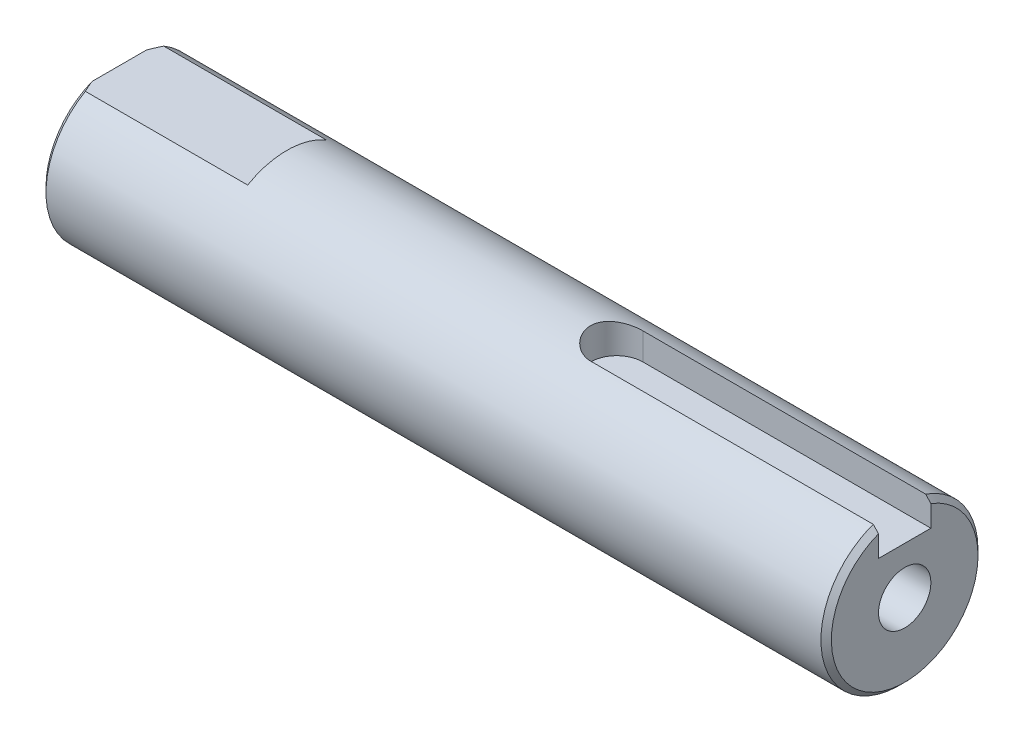
ISO-10303-21;
HEADER;
FILE_DESCRIPTION(('STEP AP214'),'2;1');
FILE_NAME('part.step','',(''),(''),'','','');
FILE_SCHEMA(('AUTOMOTIVE_DESIGN { 1 0 10303 214 1 1 1 1 }'));
ENDSEC;
DATA;
#1=APPLICATION_CONTEXT('core data for automotive mechanical design processes');
#2=APPLICATION_PROTOCOL_DEFINITION('international standard','automotive_design',2000,#1);
#3=PRODUCT_CONTEXT('',#1,'mechanical');
#4=PRODUCT('Part','Part','',(#3));
#5=PRODUCT_RELATED_PRODUCT_CATEGORY('part','',(#4));
#6=PRODUCT_DEFINITION_FORMATION('','',#4);
#7=PRODUCT_DEFINITION_CONTEXT('part definition',#1,'design');
#8=PRODUCT_DEFINITION('design','',#6,#7);
#9=PRODUCT_DEFINITION_SHAPE('','',#8);
#10=(LENGTH_UNIT() NAMED_UNIT(*) SI_UNIT(.MILLI.,.METRE.));
#11=(NAMED_UNIT(*) PLANE_ANGLE_UNIT() SI_UNIT($,.RADIAN.));
#12=(NAMED_UNIT(*) SI_UNIT($,.STERADIAN.) SOLID_ANGLE_UNIT());
#13=UNCERTAINTY_MEASURE_WITH_UNIT(LENGTH_MEASURE(1.E-05),#10,'distance_accuracy_value','');
#14=(GEOMETRIC_REPRESENTATION_CONTEXT(3) GLOBAL_UNCERTAINTY_ASSIGNED_CONTEXT((#13)) GLOBAL_UNIT_ASSIGNED_CONTEXT((#10,
#11,#12)) REPRESENTATION_CONTEXT('',''));
#15=CARTESIAN_POINT('',(0.,0.,0.));
#16=DIRECTION('',(0.,0.,1.));
#17=DIRECTION('',(1.,0.,0.));
#18=AXIS2_PLACEMENT_3D('',#15,#16,#17);
#19=CARTESIAN_POINT('',(0.,0.,0.));
#20=DIRECTION('',(1.,0.,0.));
#21=DIRECTION('',(0.,0.,-1.));
#22=AXIS2_PLACEMENT_3D('',#19,#20,#21);
#23=PLANE('',#22);
#24=DIRECTION('',(0.,0.,-1.));
#25=VECTOR('',#24,1.);
#26=CARTESIAN_POINT('',(0.,6.5,0.));
#27=LINE('',#26,#25);
#28=CARTESIAN_POINT('',(0.,6.5,2.59807621135328));
#29=VERTEX_POINT('',#28);
#30=CARTESIAN_POINT('',(0.,6.5,-2.59807621135328));
#31=VERTEX_POINT('',#30);
#32=EDGE_CURVE('E207',#29,#31,#27,.T.);
#33=ORIENTED_EDGE('',*,*,#32,.T.);
#34=CARTESIAN_POINT('',(0.,0.,0.));
#35=DIRECTION('',(1.,0.,0.));
#36=DIRECTION('',(0.,0.,-1.));
#37=AXIS2_PLACEMENT_3D('',#34,#35,#36);
#38=CIRCLE('',#37,6.99999999999998);
#39=CARTESIAN_POINT('',(0.,-6.5,-2.59807621135328));
#40=VERTEX_POINT('',#39);
#41=EDGE_CURVE('E401',#31,#40,#38,.F.);
#42=ORIENTED_EDGE('',*,*,#41,.T.);
#43=DIRECTION('',(0.,0.,1.));
#44=VECTOR('',#43,1.);
#45=CARTESIAN_POINT('',(0.,-6.5,0.));
#46=LINE('',#45,#44);
#47=CARTESIAN_POINT('',(0.,-6.5,2.59807621135328));
#48=VERTEX_POINT('',#47);
#49=EDGE_CURVE('E315',#40,#48,#46,.T.);
#50=ORIENTED_EDGE('',*,*,#49,.T.);
#51=CARTESIAN_POINT('',(0.,0.,0.));
#52=DIRECTION('',(1.,0.,0.));
#53=DIRECTION('',(0.,0.,-1.));
#54=AXIS2_PLACEMENT_3D('',#51,#52,#53);
#55=CIRCLE('',#54,6.99999999999998);
#56=EDGE_CURVE('E259',#48,#29,#55,.F.);
#57=ORIENTED_EDGE('',*,*,#56,.T.);
#58=EDGE_LOOP('',(#33,#42,#50,#57));
#59=FACE_BOUND('',#58,.T.);
#60=CARTESIAN_POINT('',(0.,0.,0.));
#61=DIRECTION('',(-1.,0.,0.));
#62=DIRECTION('',(0.,0.,1.));
#63=AXIS2_PLACEMENT_3D('',#60,#61,#62);
#64=CIRCLE('',#63,2.5);
#65=CARTESIAN_POINT('',(0.,0.,2.5));
#66=VERTEX_POINT('',#65);
#67=EDGE_CURVE('E517',#66,#66,#64,.T.);
#68=ORIENTED_EDGE('',*,*,#67,.F.);
#69=EDGE_LOOP('',(#68));
#70=FACE_BOUND('',#69,.T.);
#71=ADVANCED_FACE('F36',(#59,#70),#23,.F.);
#72=CARTESIAN_POINT('',(0.,0.,0.));
#73=DIRECTION('',(-1.,0.,0.));
#74=DIRECTION('',(0.,0.,1.));
#75=AXIS2_PLACEMENT_3D('',#72,#73,#74);
#76=CYLINDRICAL_SURFACE('',#75,7.5);
#77=DIRECTION('',(-1.,0.,0.));
#78=VECTOR('',#77,1.);
#79=CARTESIAN_POINT('',(0.,-6.5,-3.74165738677394));
#80=LINE('',#79,#78);
#81=CARTESIAN_POINT('',(16.,-6.5,-3.74165738677395));
#82=VERTEX_POINT('',#81);
#83=CARTESIAN_POINT('',(0.500000000000026,-6.5,-3.74165738677394));
#84=VERTEX_POINT('',#83);
#85=EDGE_CURVE('E163',#82,#84,#80,.T.);
#86=ORIENTED_EDGE('',*,*,#85,.T.);
#87=CARTESIAN_POINT('',(0.500000000000026,0.,0.));
#88=DIRECTION('',(1.,0.,0.));
#89=DIRECTION('',(0.,0.,-1.));
#90=AXIS2_PLACEMENT_3D('',#87,#88,#89);
#91=CIRCLE('',#90,7.5);
#92=CARTESIAN_POINT('',(0.500000000000027,6.5,-3.74165738677394));
#93=VERTEX_POINT('',#92);
#94=EDGE_CURVE('E317',#84,#93,#91,.T.);
#95=ORIENTED_EDGE('',*,*,#94,.T.);
#96=DIRECTION('',(-1.,0.,0.));
#97=VECTOR('',#96,1.);
#98=CARTESIAN_POINT('',(0.,6.5,-3.74165738677394));
#99=LINE('',#98,#97);
#100=CARTESIAN_POINT('',(16.,6.5,-3.74165738677394));
#101=VERTEX_POINT('',#100);
#102=EDGE_CURVE('E169',#93,#101,#99,.F.);
#103=ORIENTED_EDGE('',*,*,#102,.T.);
#104=CARTESIAN_POINT('',(16.,0.,0.));
#105=DIRECTION('',(1.,0.,0.));
#106=DIRECTION('',(0.,1.,0.));
#107=AXIS2_PLACEMENT_3D('',#104,#105,#106);
#108=CIRCLE('',#107,7.5);
#109=CARTESIAN_POINT('',(16.,6.5,3.74165738677394));
#110=VERTEX_POINT('',#109);
#111=EDGE_CURVE('E320',#101,#110,#108,.T.);
#112=ORIENTED_EDGE('',*,*,#111,.T.);
#113=DIRECTION('',(-1.,0.,0.));
#114=VECTOR('',#113,1.);
#115=CARTESIAN_POINT('',(0.,6.5,3.74165738677394));
#116=LINE('',#115,#114);
#117=CARTESIAN_POINT('',(0.500000000000026,6.5,3.74165738677394));
#118=VERTEX_POINT('',#117);
#119=EDGE_CURVE('E171',#110,#118,#116,.T.);
#120=ORIENTED_EDGE('',*,*,#119,.T.);
#121=CARTESIAN_POINT('',(0.500000000000026,0.,0.));
#122=DIRECTION('',(1.,0.,0.));
#123=DIRECTION('',(0.,0.,-1.));
#124=AXIS2_PLACEMENT_3D('',#121,#122,#123);
#125=CIRCLE('',#124,7.5);
#126=CARTESIAN_POINT('',(0.500000000000027,-6.5,3.74165738677394));
#127=VERTEX_POINT('',#126);
#128=EDGE_CURVE('E314',#118,#127,#125,.T.);
#129=ORIENTED_EDGE('',*,*,#128,.T.);
#130=DIRECTION('',(-1.,0.,0.));
#131=VECTOR('',#130,1.);
#132=CARTESIAN_POINT('',(0.,-6.5,3.74165738677394));
#133=LINE('',#132,#131);
#134=CARTESIAN_POINT('',(16.,-6.5,3.74165738677395));
#135=VERTEX_POINT('',#134);
#136=EDGE_CURVE('E161',#127,#135,#133,.F.);
#137=ORIENTED_EDGE('',*,*,#136,.T.);
#138=CARTESIAN_POINT('',(16.,0.,0.));
#139=DIRECTION('',(1.,0.,0.));
#140=DIRECTION('',(0.,0.,-1.));
#141=AXIS2_PLACEMENT_3D('',#138,#139,#140);
#142=CIRCLE('',#141,7.5);
#143=EDGE_CURVE('E310',#135,#82,#142,.T.);
#144=ORIENTED_EDGE('',*,*,#143,.T.);
#145=EDGE_LOOP('',(#86,#95,#103,#112,#120,#129,#137,#144));
#146=FACE_BOUND('',#145,.T.);
#147=DIRECTION('',(-1.,0.,0.));
#148=VECTOR('',#147,1.);
#149=CARTESIAN_POINT('',(0.,7.07106781186547,-2.50000000000001));
#150=LINE('',#149,#148);
#151=CARTESIAN_POINT('',(74.5,7.07106781186547,-2.50000000000001));
#152=VERTEX_POINT('',#151);
#153=CARTESIAN_POINT('',(47.5,7.07106781186547,-2.5));
#154=VERTEX_POINT('',#153);
#155=EDGE_CURVE('E189',#152,#154,#150,.T.);
#156=ORIENTED_EDGE('',*,*,#155,.F.);
#157=CARTESIAN_POINT('',(74.5,0.,0.));
#158=DIRECTION('',(-1.,0.,0.));
#159=DIRECTION('',(0.,0.,1.));
#160=AXIS2_PLACEMENT_3D('',#157,#158,#159);
#161=CIRCLE('',#160,7.5);
#162=CARTESIAN_POINT('',(74.5,7.07106781186547,2.50000000000001));
#163=VERTEX_POINT('',#162);
#164=EDGE_CURVE('E323',#152,#163,#161,.T.);
#165=ORIENTED_EDGE('',*,*,#164,.T.);
#166=DIRECTION('',(-1.,0.,0.));
#167=VECTOR('',#166,1.);
#168=CARTESIAN_POINT('',(0.,7.07106781186547,2.50000000000001));
#169=LINE('',#168,#167);
#170=CARTESIAN_POINT('',(47.5,7.07106781186547,2.5));
#171=VERTEX_POINT('',#170);
#172=EDGE_CURVE('E191',#171,#163,#169,.F.);
#173=ORIENTED_EDGE('',*,*,#172,.F.);
#174=CARTESIAN_POINT('',(47.5,7.07106781186547,-2.50000000000001));
#175=CARTESIAN_POINT('',(47.4317929221797,7.07105693273157,-2.50000899110406));
#176=CARTESIAN_POINT('',(47.3635919253246,7.07205443904569,-2.49720887221586));
#177=CARTESIAN_POINT('',(47.2277189616507,7.07598524121007,-2.48606045780471));
#178=CARTESIAN_POINT('',(47.1600468570119,7.07891801450642,-2.47771365997203));
#179=CARTESIAN_POINT('',(47.0259095116455,7.08662705252506,-2.45557459422796));
#180=CARTESIAN_POINT('',(46.9594412974491,7.09139784850118,-2.44179847763136));
#181=CARTESIAN_POINT('',(46.8279917314172,7.10262619906002,-2.40894181030121));
#182=CARTESIAN_POINT('',(46.7630104334101,7.1090838146033,-2.38986106786033));
#183=CARTESIAN_POINT('',(46.5710384202854,7.13069940793911,-2.32491551306197));
#184=CARTESIAN_POINT('',(46.44682084253,7.14811243884051,-2.27131416810251));
#185=CARTESIAN_POINT('',(46.2091231885366,7.1869703408752,-2.14517784106256));
#186=CARTESIAN_POINT('',(46.0956497642198,7.20841768551076,-2.07263123268533));
#187=CARTESIAN_POINT('',(45.8782070965292,7.25386182389478,-1.9076299584682));
#188=CARTESIAN_POINT('',(45.7747148572318,7.27792189428066,-1.81456284630834));
#189=CARTESIAN_POINT('',(45.5844828967663,7.32534626726038,-1.61247071190513));
#190=CARTESIAN_POINT('',(45.497746158681,7.34871044533518,-1.50344285413659));
#191=CARTESIAN_POINT('',(45.3413017757375,7.39284706096344,-1.26900922493972));
#192=CARTESIAN_POINT('',(45.2720976922577,7.41353593532888,-1.14325025284461));
#193=CARTESIAN_POINT('',(45.1560192175653,7.44924021883279,-0.881073095475292));
#194=CARTESIAN_POINT('',(45.1091380050743,7.46425736081204,-0.744658181225888));
#195=CARTESIAN_POINT('',(45.0406607237417,7.48647677762783,-0.470073371182916));
#196=CARTESIAN_POINT('',(45.0182418290428,7.49393272446142,-0.332129588153751));
#197=CARTESIAN_POINT('',(44.9967092432615,7.50109021034827,-0.0542474216362079));
#198=CARTESIAN_POINT('',(44.9975899990842,7.50079359709905,0.0856904786402082));
#199=CARTESIAN_POINT('',(45.0221107104005,7.49265096581776,0.357759612692397));
#200=CARTESIAN_POINT('',(45.0448565956047,7.48510152476447,0.489981756428167));
#201=CARTESIAN_POINT('',(45.1109829959792,7.46367401253772,0.748610161077307));
#202=CARTESIAN_POINT('',(45.1543646553253,7.4497955904479,0.875016099077732));
#203=CARTESIAN_POINT('',(45.2610534241944,7.41689170677793,1.12038155754034));
#204=CARTESIAN_POINT('',(45.3246151128576,7.39780094595656,1.23922126412503));
#205=CARTESIAN_POINT('',(45.469649878425,7.35645969200236,1.46481147275366));
#206=CARTESIAN_POINT('',(45.5511278276021,7.33420833994017,1.57155867428943));
#207=CARTESIAN_POINT('',(45.7341776250069,7.28765679856813,1.77524334927518));
#208=CARTESIAN_POINT('',(45.8365138590282,7.26330946699776,1.87148402903098));
#209=CARTESIAN_POINT('',(46.0561037242864,7.21618726182138,2.04568006205172));
#210=CARTESIAN_POINT('',(46.173362156007,7.19341289789386,2.12362950795974));
#211=CARTESIAN_POINT('',(46.4217004458843,7.15175078440791,2.26000831398175));
#212=CARTESIAN_POINT('',(46.5529587873326,7.13292537370586,2.31813252376915));
#213=CARTESIAN_POINT('',(46.8241174439746,7.10202742655098,2.41115057675284));
#214=CARTESIAN_POINT('',(46.9640037334303,7.08994423522482,2.4460810901384));
#215=CARTESIAN_POINT('',(47.17104659187,7.078413552368,2.47914539070206));
#216=CARTESIAN_POINT('',(47.2366034746356,7.07566669236505,2.48696265313778));
#217=CARTESIAN_POINT('',(47.3680951959995,7.07199258928497,2.49738654017799));
#218=CARTESIAN_POINT('',(47.434029436361,7.0710629982382,2.49999988848745));
#219=CARTESIAN_POINT('',(47.5,7.07106781186548,2.5));
#220=B_SPLINE_CURVE_WITH_KNOTS('',3,(#174,#175,#176,#177,#178,#179,#180,#181,#182,#183,#184,
#185,#186,#187,#188,#189,#190,#191,#192,#193,#194,#195,#196,#197,#198,#199,#200,#201,#202,#203,
#204,#205,#206,#207,#208,#209,#210,#211,#212,#213,#214,#215,#216,#217,#218,#219),.UNSPECIFIED.,
.F.,.F.,(4,2,2,2,2,2,2,2,2,2,2,2,2,2,2,2,2,2,2,2,2,2,4),(0.,0.204546211838573,0.409037215423649,
0.61292442942907,0.816819012805387,1.22401016923255,1.63145179965523,2.0532786408839,
2.47518051341065,2.9080943401445,3.34087579484514,3.75860278500203,4.17623021758302,
4.57747647846034,4.97874498952316,5.38529148746615,5.79194868153617,6.21771736826822,
6.64362337304802,7.07581676501797,7.50732520398794,7.70536340013574,7.90314555504338),.UNSPECIFIED.);
#221=EDGE_CURVE('E199',#154,#171,#220,.T.);
#222=ORIENTED_EDGE('',*,*,#221,.F.);
#223=EDGE_LOOP('',(#156,#165,#173,#222));
#224=FACE_BOUND('',#223,.T.);
#225=ADVANCED_FACE('F209',(#146,#224),#76,.T.);
#226=CARTESIAN_POINT('',(75.,7.5,0.));
#227=DIRECTION('',(-1.,0.,0.));
#228=DIRECTION('',(0.,0.,1.));
#229=AXIS2_PLACEMENT_3D('',#226,#227,#228);
#230=PLANE('',#229);
#231=CARTESIAN_POINT('',(75.,0.,0.));
#232=DIRECTION('',(1.,0.,0.));
#233=DIRECTION('',(0.,0.,-1.));
#234=AXIS2_PLACEMENT_3D('',#231,#232,#233);
#235=CIRCLE('',#234,2.5);
#236=CARTESIAN_POINT('',(75.,0.,-2.5));
#237=VERTEX_POINT('',#236);
#238=EDGE_CURVE('E139',#237,#237,#235,.T.);
#239=ORIENTED_EDGE('',*,*,#238,.F.);
#240=EDGE_LOOP('',(#239));
#241=FACE_BOUND('',#240,.T.);
#242=DIRECTION('',(0.,-1.,0.));
#243=VECTOR('',#242,1.);
#244=CARTESIAN_POINT('',(75.,7.5,2.5));
#245=LINE('',#244,#243);
#246=CARTESIAN_POINT('',(75.,6.53834841531099,2.5));
#247=VERTEX_POINT('',#246);
#248=CARTESIAN_POINT('',(75.,4.5,2.5));
#249=VERTEX_POINT('',#248);
#250=EDGE_CURVE('E197',#247,#249,#245,.T.);
#251=ORIENTED_EDGE('',*,*,#250,.F.);
#252=CARTESIAN_POINT('',(75.,0.,0.));
#253=DIRECTION('',(-1.,0.,0.));
#254=DIRECTION('',(0.,0.,1.));
#255=AXIS2_PLACEMENT_3D('',#252,#253,#254);
#256=CIRCLE('',#255,6.99999999999998);
#257=CARTESIAN_POINT('',(75.,6.53834841531099,-2.5));
#258=VERTEX_POINT('',#257);
#259=EDGE_CURVE('E260',#247,#258,#256,.F.);
#260=ORIENTED_EDGE('',*,*,#259,.T.);
#261=DIRECTION('',(0.,1.,0.));
#262=VECTOR('',#261,1.);
#263=CARTESIAN_POINT('',(75.,7.5,-2.5));
#264=LINE('',#263,#262);
#265=CARTESIAN_POINT('',(75.,4.5,-2.5));
#266=VERTEX_POINT('',#265);
#267=EDGE_CURVE('E194',#266,#258,#264,.T.);
#268=ORIENTED_EDGE('',*,*,#267,.F.);
#269=DIRECTION('',(0.,0.,-1.));
#270=VECTOR('',#269,1.);
#271=CARTESIAN_POINT('',(75.,4.5,-2.5));
#272=LINE('',#271,#270);
#273=EDGE_CURVE('E180',#249,#266,#272,.T.);
#274=ORIENTED_EDGE('',*,*,#273,.F.);
#275=EDGE_LOOP('',(#251,#260,#268,#274));
#276=FACE_BOUND('',#275,.T.);
#277=ADVANCED_FACE('F218',(#241,#276),#230,.F.);
#278=CARTESIAN_POINT('',(47.5,7.5,0.));
#279=DIRECTION('',(0.,-1.,0.));
#280=DIRECTION('',(0.,0.,-1.));
#281=AXIS2_PLACEMENT_3D('',#278,#279,#280);
#282=CYLINDRICAL_SURFACE('',#281,2.5);
#283=DIRECTION('',(0.,-1.,0.));
#284=VECTOR('',#283,1.);
#285=CARTESIAN_POINT('',(47.5,7.5,-2.5));
#286=LINE('',#285,#284);
#287=CARTESIAN_POINT('',(47.5,4.5,-2.5));
#288=VERTEX_POINT('',#287);
#289=EDGE_CURVE('E185',#154,#288,#286,.T.);
#290=ORIENTED_EDGE('',*,*,#289,.F.);
#291=ORIENTED_EDGE('',*,*,#221,.T.);
#292=DIRECTION('',(0.,-1.,0.));
#293=VECTOR('',#292,1.);
#294=CARTESIAN_POINT('',(47.5,7.5,2.5));
#295=LINE('',#294,#293);
#296=CARTESIAN_POINT('',(47.5,4.5,2.5));
#297=VERTEX_POINT('',#296);
#298=EDGE_CURVE('E187',#171,#297,#295,.T.);
#299=ORIENTED_EDGE('',*,*,#298,.T.);
#300=CARTESIAN_POINT('',(47.5,4.5,0.));
#301=DIRECTION('',(0.,1.,0.));
#302=DIRECTION('',(0.,0.,1.));
#303=AXIS2_PLACEMENT_3D('',#300,#301,#302);
#304=CIRCLE('',#303,2.5);
#305=EDGE_CURVE('E174',#288,#297,#304,.T.);
#306=ORIENTED_EDGE('',*,*,#305,.F.);
#307=EDGE_LOOP('',(#290,#291,#299,#306));
#308=FACE_BOUND('',#307,.T.);
#309=ADVANCED_FACE('F213',(#308),#282,.F.);
#310=CARTESIAN_POINT('',(75.,7.5,2.5));
#311=DIRECTION('',(0.,0.,-1.));
#312=DIRECTION('',(-1.,0.,0.));
#313=AXIS2_PLACEMENT_3D('',#310,#311,#312);
#314=PLANE('',#313);
#315=ORIENTED_EDGE('',*,*,#172,.T.);
#316=CARTESIAN_POINT('',(74.5,7.07106781186547,2.50000000000001));
#317=CARTESIAN_POINT('',(74.5835398180439,6.98247505606885,2.5));
#318=CARTESIAN_POINT('',(74.6669763917944,6.89378539719896,2.5));
#319=CARTESIAN_POINT('',(74.8336430584803,6.71621226503221,2.5));
#320=CARTESIAN_POINT('',(74.9168731513965,6.62732879171728,2.5));
#321=CARTESIAN_POINT('',(75.,6.538348415311,2.5));
#322=B_SPLINE_CURVE_WITH_KNOTS('',3,(#316,#317,#318,#319,#320,#321),.UNSPECIFIED.,.F.,.F.,(4,2,
4),(0.,0.365304882074009,0.730609798217041),.UNSPECIFIED.);
#323=EDGE_CURVE('E245',#163,#247,#322,.T.);
#324=ORIENTED_EDGE('',*,*,#323,.T.);
#325=ORIENTED_EDGE('',*,*,#250,.T.);
#326=DIRECTION('',(1.,0.,0.));
#327=VECTOR('',#326,1.);
#328=CARTESIAN_POINT('',(75.,4.5,2.5));
#329=LINE('',#328,#327);
#330=EDGE_CURVE('E177',#297,#249,#329,.T.);
#331=ORIENTED_EDGE('',*,*,#330,.F.);
#332=ORIENTED_EDGE('',*,*,#298,.F.);
#333=EDGE_LOOP('',(#315,#324,#325,#331,#332));
#334=FACE_BOUND('',#333,.T.);
#335=ADVANCED_FACE('F217',(#334),#314,.T.);
#336=CARTESIAN_POINT('',(47.5,7.5,-2.5));
#337=DIRECTION('',(0.,0.,1.));
#338=DIRECTION('',(1.,0.,0.));
#339=AXIS2_PLACEMENT_3D('',#336,#337,#338);
#340=PLANE('',#339);
#341=ORIENTED_EDGE('',*,*,#267,.T.);
#342=CARTESIAN_POINT('',(75.,6.53834841531099,-2.5));
#343=CARTESIAN_POINT('',(74.9168731513965,6.62732879171728,-2.5));
#344=CARTESIAN_POINT('',(74.8336430584803,6.71621226503221,-2.5));
#345=CARTESIAN_POINT('',(74.6669763917944,6.89378539719896,-2.5));
#346=CARTESIAN_POINT('',(74.5835398180439,6.98247505606886,-2.5));
#347=CARTESIAN_POINT('',(74.5,7.07106781186548,-2.5));
#348=B_SPLINE_CURVE_WITH_KNOTS('',3,(#342,#343,#344,#345,#346,#347),.UNSPECIFIED.,.F.,.F.,(4,2,
4),(0.,0.365304916143033,0.730609798217045),.UNSPECIFIED.);
#349=EDGE_CURVE('E253',#258,#152,#348,.T.);
#350=ORIENTED_EDGE('',*,*,#349,.T.);
#351=ORIENTED_EDGE('',*,*,#155,.T.);
#352=ORIENTED_EDGE('',*,*,#289,.T.);
#353=DIRECTION('',(-1.,0.,0.));
#354=VECTOR('',#353,1.);
#355=CARTESIAN_POINT('',(47.5,4.5,-2.5));
#356=LINE('',#355,#354);
#357=EDGE_CURVE('E182',#266,#288,#356,.T.);
#358=ORIENTED_EDGE('',*,*,#357,.F.);
#359=EDGE_LOOP('',(#341,#350,#351,#352,#358));
#360=FACE_BOUND('',#359,.T.);
#361=ADVANCED_FACE('F262',(#360),#340,.T.);
#362=CARTESIAN_POINT('',(47.5,4.5,0.));
#363=DIRECTION('',(0.,1.,0.));
#364=DIRECTION('',(0.,0.,1.));
#365=AXIS2_PLACEMENT_3D('',#362,#363,#364);
#366=PLANE('',#365);
#367=ORIENTED_EDGE('',*,*,#305,.T.);
#368=ORIENTED_EDGE('',*,*,#330,.T.);
#369=ORIENTED_EDGE('',*,*,#273,.T.);
#370=ORIENTED_EDGE('',*,*,#357,.T.);
#371=EDGE_LOOP('',(#367,#368,#369,#370));
#372=FACE_BOUND('',#371,.T.);
#373=ADVANCED_FACE('F266',(#372),#366,.T.);
#374=CARTESIAN_POINT('',(16.,6.5,-7.5));
#375=DIRECTION('',(1.,0.,0.));
#376=DIRECTION('',(0.,1.,0.));
#377=AXIS2_PLACEMENT_3D('',#374,#375,#376);
#378=PLANE('',#377);
#379=ORIENTED_EDGE('',*,*,#111,.F.);
#380=DIRECTION('',(0.,0.,1.));
#381=VECTOR('',#380,1.);
#382=CARTESIAN_POINT('',(16.,6.5,-7.5));
#383=LINE('',#382,#381);
#384=EDGE_CURVE('E166',#101,#110,#383,.T.);
#385=ORIENTED_EDGE('',*,*,#384,.T.);
#386=EDGE_LOOP('',(#379,#385));
#387=FACE_BOUND('',#386,.T.);
#388=ADVANCED_FACE('F269',(#387),#378,.F.);
#389=CARTESIAN_POINT('',(0.,6.5,-7.5));
#390=DIRECTION('',(0.,-1.,0.));
#391=DIRECTION('',(0.,0.,-1.));
#392=AXIS2_PLACEMENT_3D('',#389,#390,#391);
#393=PLANE('',#392);
#394=ORIENTED_EDGE('',*,*,#102,.F.);
#395=CARTESIAN_POINT('',(0.500000000000026,6.5,-3.74165738677394));
#396=CARTESIAN_POINT('',(0.453535504056659,6.5,-3.64851517289654));
#397=CARTESIAN_POINT('',(0.40810725975852,6.5,-3.5548497431881));
#398=CARTESIAN_POINT('',(0.319591651075283,6.5,-3.36650238385664));
#399=CARTESIAN_POINT('',(0.276502629456008,6.5,-3.27182123231764));
#400=CARTESIAN_POINT('',(0.192863066931709,6.5,-3.08133102900949));
#401=CARTESIAN_POINT('',(0.152312731418815,6.5,-2.98552188672345));
#402=CARTESIAN_POINT('',(0.0739933775286079,6.5,-2.79269458247043));
#403=CARTESIAN_POINT('',(0.0362263787623952,6.5,-2.69567560116999));
#404=CARTESIAN_POINT('',(0.,6.5,-2.59807621135327));
#405=B_SPLINE_CURVE_WITH_KNOTS('',3,(#395,#396,#397,#398,#399,#400,#401,#402,#403,#404),
.UNSPECIFIED.,.F.,.F.,(4,2,2,2,4),(0.,0.312267207174209,0.624310219975622,0.936378446045594,
1.24867092620929),.UNSPECIFIED.);
#406=EDGE_CURVE('E11',#93,#31,#405,.T.);
#407=ORIENTED_EDGE('',*,*,#406,.T.);
#408=ORIENTED_EDGE('',*,*,#32,.F.);
#409=CARTESIAN_POINT('',(0.,6.5,2.59807621135327));
#410=CARTESIAN_POINT('',(0.0362263787623959,6.5,2.69567560116999));
#411=CARTESIAN_POINT('',(0.0739933775286087,6.5,2.79269458247043));
#412=CARTESIAN_POINT('',(0.152312731418816,6.5,2.98552188672346));
#413=CARTESIAN_POINT('',(0.192863066931709,6.5,3.08133102900949));
#414=CARTESIAN_POINT('',(0.276502629456008,6.5,3.27182123231764));
#415=CARTESIAN_POINT('',(0.319591651075283,6.5,3.36650238385664));
#416=CARTESIAN_POINT('',(0.40810725975852,6.5,3.5548497431881));
#417=CARTESIAN_POINT('',(0.453535504056659,6.5,3.64851517289654));
#418=CARTESIAN_POINT('',(0.500000000000026,6.5,3.74165738677394));
#419=B_SPLINE_CURVE_WITH_KNOTS('',3,(#409,#410,#411,#412,#413,#414,#415,#416,#417,#418),
.UNSPECIFIED.,.F.,.F.,(4,2,2,2,4),(0.,0.312292480163695,0.624360706233666,0.936403719035079,
1.24867092620929),.UNSPECIFIED.);
#420=EDGE_CURVE('E50',#29,#118,#419,.T.);
#421=ORIENTED_EDGE('',*,*,#420,.T.);
#422=ORIENTED_EDGE('',*,*,#119,.F.);
#423=ORIENTED_EDGE('',*,*,#384,.F.);
#424=EDGE_LOOP('',(#394,#407,#408,#421,#422,#423));
#425=FACE_BOUND('',#424,.T.);
#426=ADVANCED_FACE('F271',(#425),#393,.F.);
#427=CARTESIAN_POINT('',(16.,-6.5,-7.5));
#428=DIRECTION('',(1.,0.,0.));
#429=DIRECTION('',(0.,0.,-1.));
#430=AXIS2_PLACEMENT_3D('',#427,#428,#429);
#431=PLANE('',#430);
#432=DIRECTION('',(0.,0.,1.));
#433=VECTOR('',#432,1.);
#434=CARTESIAN_POINT('',(16.,-6.5,-7.5));
#435=LINE('',#434,#433);
#436=EDGE_CURVE('E158',#82,#135,#435,.T.);
#437=ORIENTED_EDGE('',*,*,#436,.F.);
#438=ORIENTED_EDGE('',*,*,#143,.F.);
#439=EDGE_LOOP('',(#437,#438));
#440=FACE_BOUND('',#439,.T.);
#441=ADVANCED_FACE('F275',(#440),#431,.F.);
#442=CARTESIAN_POINT('',(0.,-6.5,-7.5));
#443=DIRECTION('',(0.,1.,0.));
#444=DIRECTION('',(-1.,0.,0.));
#445=AXIS2_PLACEMENT_3D('',#442,#443,#444);
#446=PLANE('',#445);
#447=ORIENTED_EDGE('',*,*,#49,.F.);
#448=CARTESIAN_POINT('',(0.,-6.5,-2.59807621135327));
#449=CARTESIAN_POINT('',(0.0362263787623959,-6.5,-2.69567560116999));
#450=CARTESIAN_POINT('',(0.0739933775286086,-6.5,-2.79269458247043));
#451=CARTESIAN_POINT('',(0.152312731418816,-6.5,-2.98552188672346));
#452=CARTESIAN_POINT('',(0.192863066931709,-6.5,-3.08133102900949));
#453=CARTESIAN_POINT('',(0.276502629456008,-6.5,-3.27182123231764));
#454=CARTESIAN_POINT('',(0.319591651075283,-6.5,-3.36650238385664));
#455=CARTESIAN_POINT('',(0.40810725975852,-6.5,-3.5548497431881));
#456=CARTESIAN_POINT('',(0.453535504056659,-6.5,-3.64851517289654));
#457=CARTESIAN_POINT('',(0.500000000000026,-6.5,-3.74165738677394));
#458=B_SPLINE_CURVE_WITH_KNOTS('',3,(#448,#449,#450,#451,#452,#453,#454,#455,#456,#457),
.UNSPECIFIED.,.F.,.F.,(4,2,2,2,4),(0.,0.312292480163695,0.624360706233666,0.936403719035079,
1.24867092620929),.UNSPECIFIED.);
#459=EDGE_CURVE('E283',#40,#84,#458,.T.);
#460=ORIENTED_EDGE('',*,*,#459,.T.);
#461=ORIENTED_EDGE('',*,*,#85,.F.);
#462=ORIENTED_EDGE('',*,*,#436,.T.);
#463=ORIENTED_EDGE('',*,*,#136,.F.);
#464=CARTESIAN_POINT('',(0.500000000000026,-6.5,3.74165738677394));
#465=CARTESIAN_POINT('',(0.453535504056659,-6.5,3.64851517289654));
#466=CARTESIAN_POINT('',(0.40810725975852,-6.5,3.5548497431881));
#467=CARTESIAN_POINT('',(0.319591651075283,-6.5,3.36650238385664));
#468=CARTESIAN_POINT('',(0.276502629456008,-6.5,3.27182123231764));
#469=CARTESIAN_POINT('',(0.192863066931709,-6.5,3.08133102900949));
#470=CARTESIAN_POINT('',(0.152312731418816,-6.5,2.98552188672345));
#471=CARTESIAN_POINT('',(0.0739933775286087,-6.5,2.79269458247043));
#472=CARTESIAN_POINT('',(0.0362263787623958,-6.5,2.69567560116999));
#473=CARTESIAN_POINT('',(0.,-6.5,2.59807621135328));
#474=B_SPLINE_CURVE_WITH_KNOTS('',3,(#464,#465,#466,#467,#468,#469,#470,#471,#472,#473),
.UNSPECIFIED.,.F.,.F.,(4,2,2,2,4),(0.,0.312267207174209,0.624310219975622,0.936378446045594,
1.24867092620929),.UNSPECIFIED.);
#475=EDGE_CURVE('E290',#127,#48,#474,.T.);
#476=ORIENTED_EDGE('',*,*,#475,.T.);
#477=EDGE_LOOP('',(#447,#460,#461,#462,#463,#476));
#478=FACE_BOUND('',#477,.T.);
#479=ADVANCED_FACE('F295',(#478),#446,.F.);
#480=CARTESIAN_POINT('',(61.,0.,0.));
#481=DIRECTION('',(1.,0.,0.));
#482=DIRECTION('',(0.,0.,-1.));
#483=AXIS2_PLACEMENT_3D('',#480,#481,#482);
#484=CONICAL_SURFACE('',#483,2.1,1.02974425867665);
#485=CARTESIAN_POINT('',(59.7381927000421,0.,0.));
#486=VERTEX_POINT('',#485);
#487=VERTEX_LOOP('',#486);
#488=FACE_BOUND('',#487,.T.);
#489=CARTESIAN_POINT('',(61.,0.,0.));
#490=DIRECTION('',(1.,0.,0.));
#491=DIRECTION('',(0.,0.,-1.));
#492=AXIS2_PLACEMENT_3D('',#489,#490,#491);
#493=CIRCLE('',#492,2.1);
#494=CARTESIAN_POINT('',(61.,0.,-2.1));
#495=VERTEX_POINT('',#494);
#496=EDGE_CURVE('E155',#495,#495,#493,.T.);
#497=ORIENTED_EDGE('',*,*,#496,.T.);
#498=EDGE_LOOP('',(#497));
#499=FACE_BOUND('',#498,.T.);
#500=ADVANCED_FACE('F299',(#488,#499),#484,.F.);
#501=CARTESIAN_POINT('',(75.,0.,0.));
#502=DIRECTION('',(1.,0.,0.));
#503=DIRECTION('',(0.,0.,-1.));
#504=AXIS2_PLACEMENT_3D('',#501,#502,#503);
#505=CYLINDRICAL_SURFACE('',#504,2.1);
#506=ORIENTED_EDGE('',*,*,#496,.F.);
#507=EDGE_LOOP('',(#506));
#508=FACE_BOUND('',#507,.T.);
#509=CARTESIAN_POINT('',(65.,0.,0.));
#510=DIRECTION('',(1.,0.,0.));
#511=DIRECTION('',(0.,0.,-1.));
#512=AXIS2_PLACEMENT_3D('',#509,#510,#511);
#513=CIRCLE('',#512,2.1);
#514=CARTESIAN_POINT('',(65.,0.,-2.1));
#515=VERTEX_POINT('',#514);
#516=EDGE_CURVE('E152',#515,#515,#513,.T.);
#517=ORIENTED_EDGE('',*,*,#516,.T.);
#518=EDGE_LOOP('',(#517));
#519=FACE_BOUND('',#518,.T.);
#520=ADVANCED_FACE('F443',(#508,#519),#505,.F.);
#521=CARTESIAN_POINT('',(65.,2.1,0.));
#522=DIRECTION('',(-1.,0.,0.));
#523=DIRECTION('',(0.,0.,1.));
#524=AXIS2_PLACEMENT_3D('',#521,#522,#523);
#525=PLANE('',#524);
#526=ORIENTED_EDGE('',*,*,#516,.F.);
#527=EDGE_LOOP('',(#526));
#528=FACE_BOUND('',#527,.T.);
#529=CARTESIAN_POINT('',(65.,0.,0.));
#530=DIRECTION('',(1.,0.,0.));
#531=DIRECTION('',(0.,0.,-1.));
#532=AXIS2_PLACEMENT_3D('',#529,#530,#531);
#533=CIRCLE('',#532,2.5);
#534=CARTESIAN_POINT('',(65.,0.,-2.5));
#535=VERTEX_POINT('',#534);
#536=EDGE_CURVE('E143',#535,#535,#533,.T.);
#537=ORIENTED_EDGE('',*,*,#536,.T.);
#538=EDGE_LOOP('',(#537));
#539=FACE_BOUND('',#538,.T.);
#540=ADVANCED_FACE('F436',(#528,#539),#525,.F.);
#541=CARTESIAN_POINT('',(75.,0.,0.));
#542=DIRECTION('',(1.,0.,0.));
#543=DIRECTION('',(0.,0.,-1.));
#544=AXIS2_PLACEMENT_3D('',#541,#542,#543);
#545=CYLINDRICAL_SURFACE('',#544,2.5);
#546=ORIENTED_EDGE('',*,*,#536,.F.);
#547=EDGE_LOOP('',(#546));
#548=FACE_BOUND('',#547,.T.);
#549=ORIENTED_EDGE('',*,*,#238,.T.);
#550=EDGE_LOOP('',(#549));
#551=FACE_BOUND('',#550,.T.);
#552=ADVANCED_FACE('F133',(#548,#551),#545,.F.);
#553=CARTESIAN_POINT('',(14.,0.,0.));
#554=DIRECTION('',(-1.,0.,0.));
#555=DIRECTION('',(0.,0.,1.));
#556=AXIS2_PLACEMENT_3D('',#553,#554,#555);
#557=CONICAL_SURFACE('',#556,2.1,1.02974425867665);
#558=CARTESIAN_POINT('',(15.2618072999579,0.,0.));
#559=VERTEX_POINT('',#558);
#560=VERTEX_LOOP('',#559);
#561=FACE_BOUND('',#560,.T.);
#562=CARTESIAN_POINT('',(14.,0.,0.));
#563=DIRECTION('',(-1.,0.,0.));
#564=DIRECTION('',(0.,0.,1.));
#565=AXIS2_PLACEMENT_3D('',#562,#563,#564);
#566=CIRCLE('',#565,2.1);
#567=CARTESIAN_POINT('',(14.,0.,2.1));
#568=VERTEX_POINT('',#567);
#569=EDGE_CURVE('E137',#568,#568,#566,.T.);
#570=ORIENTED_EDGE('',*,*,#569,.T.);
#571=EDGE_LOOP('',(#570));
#572=FACE_BOUND('',#571,.T.);
#573=ADVANCED_FACE('F129',(#561,#572),#557,.F.);
#574=CARTESIAN_POINT('',(0.,0.,0.));
#575=DIRECTION('',(-1.,0.,0.));
#576=DIRECTION('',(0.,0.,1.));
#577=AXIS2_PLACEMENT_3D('',#574,#575,#576);
#578=CYLINDRICAL_SURFACE('',#577,2.1);
#579=ORIENTED_EDGE('',*,*,#569,.F.);
#580=EDGE_LOOP('',(#579));
#581=FACE_BOUND('',#580,.T.);
#582=CARTESIAN_POINT('',(10.,0.,0.));
#583=DIRECTION('',(-1.,0.,0.));
#584=DIRECTION('',(0.,0.,1.));
#585=AXIS2_PLACEMENT_3D('',#582,#583,#584);
#586=CIRCLE('',#585,2.1);
#587=CARTESIAN_POINT('',(10.,0.,2.1));
#588=VERTEX_POINT('',#587);
#589=EDGE_CURVE('E140',#588,#588,#586,.T.);
#590=ORIENTED_EDGE('',*,*,#589,.T.);
#591=EDGE_LOOP('',(#590));
#592=FACE_BOUND('',#591,.T.);
#593=ADVANCED_FACE('F132',(#581,#592),#578,.F.);
#594=CARTESIAN_POINT('',(10.,2.1,0.));
#595=DIRECTION('',(1.,0.,0.));
#596=DIRECTION('',(0.,0.,-1.));
#597=AXIS2_PLACEMENT_3D('',#594,#595,#596);
#598=PLANE('',#597);
#599=ORIENTED_EDGE('',*,*,#589,.F.);
#600=EDGE_LOOP('',(#599));
#601=FACE_BOUND('',#600,.T.);
#602=CARTESIAN_POINT('',(10.,0.,0.));
#603=DIRECTION('',(-1.,0.,0.));
#604=DIRECTION('',(0.,0.,1.));
#605=AXIS2_PLACEMENT_3D('',#602,#603,#604);
#606=CIRCLE('',#605,2.5);
#607=CARTESIAN_POINT('',(10.,0.,2.5));
#608=VERTEX_POINT('',#607);
#609=EDGE_CURVE('E146',#608,#608,#606,.T.);
#610=ORIENTED_EDGE('',*,*,#609,.T.);
#611=EDGE_LOOP('',(#610));
#612=FACE_BOUND('',#611,.T.);
#613=ADVANCED_FACE('F410',(#601,#612),#598,.F.);
#614=CARTESIAN_POINT('',(0.,0.,0.));
#615=DIRECTION('',(-1.,0.,0.));
#616=DIRECTION('',(0.,0.,1.));
#617=AXIS2_PLACEMENT_3D('',#614,#615,#616);
#618=CYLINDRICAL_SURFACE('',#617,2.5);
#619=ORIENTED_EDGE('',*,*,#609,.F.);
#620=EDGE_LOOP('',(#619));
#621=FACE_BOUND('',#620,.T.);
#622=ORIENTED_EDGE('',*,*,#67,.T.);
#623=EDGE_LOOP('',(#622));
#624=FACE_BOUND('',#623,.T.);
#625=ADVANCED_FACE('F240',(#621,#624),#618,.F.);
#626=CARTESIAN_POINT('',(74.5,0.,0.));
#627=DIRECTION('',(-1.,0.,0.));
#628=DIRECTION('',(0.,0.,1.));
#629=AXIS2_PLACEMENT_3D('',#626,#627,#628);
#630=CONICAL_SURFACE('',#629,7.5,0.785398163397449);
#631=ORIENTED_EDGE('',*,*,#349,.F.);
#632=ORIENTED_EDGE('',*,*,#259,.F.);
#633=ORIENTED_EDGE('',*,*,#323,.F.);
#634=ORIENTED_EDGE('',*,*,#164,.F.);
#635=EDGE_LOOP('',(#631,#632,#633,#634));
#636=FACE_BOUND('',#635,.T.);
#637=ADVANCED_FACE('F236',(#636),#630,.T.);
#638=CARTESIAN_POINT('',(0.,0.,0.));
#639=DIRECTION('',(1.,0.,0.));
#640=DIRECTION('',(0.,0.,-1.));
#641=AXIS2_PLACEMENT_3D('',#638,#639,#640);
#642=CONICAL_SURFACE('',#641,6.99999999999998,0.785398163397437);
#643=ORIENTED_EDGE('',*,*,#406,.F.);
#644=ORIENTED_EDGE('',*,*,#94,.F.);
#645=ORIENTED_EDGE('',*,*,#459,.F.);
#646=ORIENTED_EDGE('',*,*,#41,.F.);
#647=EDGE_LOOP('',(#643,#644,#645,#646));
#648=FACE_BOUND('',#647,.T.);
#649=ADVANCED_FACE('F239',(#648),#642,.T.);
#650=CARTESIAN_POINT('',(0.,0.,0.));
#651=DIRECTION('',(1.,0.,0.));
#652=DIRECTION('',(0.,0.,-1.));
#653=AXIS2_PLACEMENT_3D('',#650,#651,#652);
#654=CONICAL_SURFACE('',#653,6.99999999999998,0.785398163397437);
#655=ORIENTED_EDGE('',*,*,#475,.F.);
#656=ORIENTED_EDGE('',*,*,#128,.F.);
#657=ORIENTED_EDGE('',*,*,#420,.F.);
#658=ORIENTED_EDGE('',*,*,#56,.F.);
#659=EDGE_LOOP('',(#655,#656,#657,#658));
#660=FACE_BOUND('',#659,.T.);
#661=ADVANCED_FACE('F38',(#660),#654,.T.);
#662=CLOSED_SHELL('',(#71,#225,#277,#309,#335,#361,#373,#388,#426,#441,#479,#500,#520,#540,#552,
#573,#593,#613,#625,#637,#649,#661));
#663=MANIFOLD_SOLID_BREP('B2',#662);
#664=ADVANCED_BREP_SHAPE_REPRESENTATION('',(#18,#663),#14);
#665=SHAPE_DEFINITION_REPRESENTATION(#9,#664);
ENDSEC;
END-ISO-10303-21;
